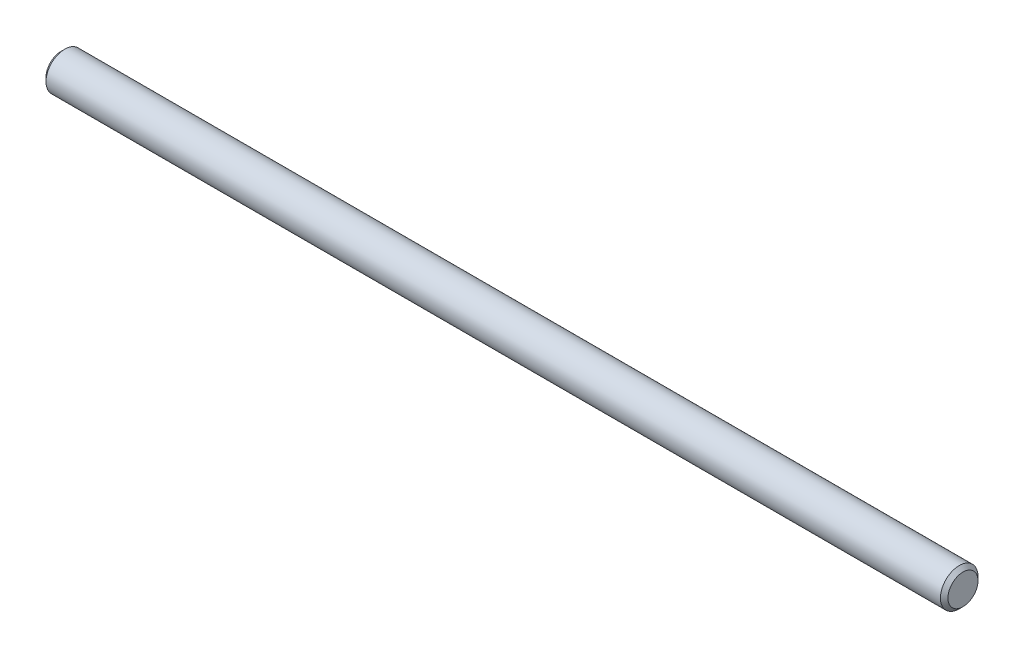
ISO-10303-21;
HEADER;
FILE_DESCRIPTION(('STEP AP214'),'2;1');
FILE_NAME('part.step','',(''),(''),'','','');
FILE_SCHEMA(('AUTOMOTIVE_DESIGN { 1 0 10303 214 1 1 1 1 }'));
ENDSEC;
DATA;
#1=APPLICATION_CONTEXT('core data for automotive mechanical design processes');
#2=APPLICATION_PROTOCOL_DEFINITION('international standard','automotive_design',2000,#1);
#3=PRODUCT_CONTEXT('',#1,'mechanical');
#4=PRODUCT('Part','Part','',(#3));
#5=PRODUCT_RELATED_PRODUCT_CATEGORY('part','',(#4));
#6=PRODUCT_DEFINITION_FORMATION('','',#4);
#7=PRODUCT_DEFINITION_CONTEXT('part definition',#1,'design');
#8=PRODUCT_DEFINITION('design','',#6,#7);
#9=PRODUCT_DEFINITION_SHAPE('','',#8);
#10=(LENGTH_UNIT() NAMED_UNIT(*) SI_UNIT(.MILLI.,.METRE.));
#11=(NAMED_UNIT(*) PLANE_ANGLE_UNIT() SI_UNIT($,.RADIAN.));
#12=(NAMED_UNIT(*) SI_UNIT($,.STERADIAN.) SOLID_ANGLE_UNIT());
#13=UNCERTAINTY_MEASURE_WITH_UNIT(LENGTH_MEASURE(1.E-05),#10,'distance_accuracy_value','');
#14=(GEOMETRIC_REPRESENTATION_CONTEXT(3) GLOBAL_UNCERTAINTY_ASSIGNED_CONTEXT((#13)) GLOBAL_UNIT_ASSIGNED_CONTEXT((#10,
#11,#12)) REPRESENTATION_CONTEXT('',''));
#15=CARTESIAN_POINT('',(0.,0.,0.));
#16=DIRECTION('',(0.,0.,1.));
#17=DIRECTION('',(1.,0.,0.));
#18=AXIS2_PLACEMENT_3D('',#15,#16,#17);
#19=CARTESIAN_POINT('',(96.,0.,0.));
#20=DIRECTION('',(-1.,0.,0.));
#21=DIRECTION('',(0.,0.,1.));
#22=AXIS2_PLACEMENT_3D('',#19,#20,#21);
#23=CYLINDRICAL_SURFACE('',#22,4.);
#24=CARTESIAN_POINT('',(-95.2,0.,0.));
#25=DIRECTION('',(1.,0.,0.));
#26=DIRECTION('',(0.,0.,-1.));
#27=AXIS2_PLACEMENT_3D('',#24,#25,#26);
#28=CIRCLE('',#27,4.);
#29=CARTESIAN_POINT('',(-95.2,0.,-4.));
#30=VERTEX_POINT('',#29);
#31=EDGE_CURVE('E48',#30,#30,#28,.T.);
#32=ORIENTED_EDGE('',*,*,#31,.T.);
#33=EDGE_LOOP('',(#32));
#34=FACE_BOUND('',#33,.T.);
#35=CARTESIAN_POINT('',(95.2,0.,0.));
#36=DIRECTION('',(1.,0.,0.));
#37=DIRECTION('',(0.,0.,-1.));
#38=AXIS2_PLACEMENT_3D('',#35,#36,#37);
#39=CIRCLE('',#38,4.);
#40=CARTESIAN_POINT('',(95.2,0.,-4.));
#41=VERTEX_POINT('',#40);
#42=EDGE_CURVE('E52',#41,#41,#39,.F.);
#43=ORIENTED_EDGE('',*,*,#42,.T.);
#44=EDGE_LOOP('',(#43));
#45=FACE_BOUND('',#44,.T.);
#46=ADVANCED_FACE('F37',(#34,#45),#23,.T.);
#47=CARTESIAN_POINT('',(96.,0.,0.));
#48=DIRECTION('',(1.,0.,0.));
#49=DIRECTION('',(0.,0.,-1.));
#50=AXIS2_PLACEMENT_3D('',#47,#48,#49);
#51=PLANE('',#50);
#52=CARTESIAN_POINT('',(96.,0.,0.));
#53=DIRECTION('',(1.,0.,0.));
#54=DIRECTION('',(0.,0.,-1.));
#55=AXIS2_PLACEMENT_3D('',#52,#53,#54);
#56=CIRCLE('',#55,3.19999999999998);
#57=CARTESIAN_POINT('',(96.,0.,-3.19999999999998));
#58=VERTEX_POINT('',#57);
#59=EDGE_CURVE('E10',#58,#58,#56,.T.);
#60=ORIENTED_EDGE('',*,*,#59,.T.);
#61=EDGE_LOOP('',(#60));
#62=FACE_BOUND('',#61,.T.);
#63=ADVANCED_FACE('F68',(#62),#51,.T.);
#64=CARTESIAN_POINT('',(-96.,0.,0.));
#65=DIRECTION('',(1.,0.,0.));
#66=DIRECTION('',(0.,0.,-1.));
#67=AXIS2_PLACEMENT_3D('',#64,#65,#66);
#68=PLANE('',#67);
#69=CARTESIAN_POINT('',(-96.,0.,0.));
#70=DIRECTION('',(1.,0.,0.));
#71=DIRECTION('',(0.,0.,-1.));
#72=AXIS2_PLACEMENT_3D('',#69,#70,#71);
#73=CIRCLE('',#72,3.19999999999995);
#74=CARTESIAN_POINT('',(-96.,0.,-3.19999999999995));
#75=VERTEX_POINT('',#74);
#76=EDGE_CURVE('E44',#75,#75,#73,.F.);
#77=ORIENTED_EDGE('',*,*,#76,.T.);
#78=EDGE_LOOP('',(#77));
#79=FACE_BOUND('',#78,.T.);
#80=ADVANCED_FACE('F65',(#79),#68,.F.);
#81=CARTESIAN_POINT('',(-95.2,0.,0.));
#82=DIRECTION('',(1.,0.,0.));
#83=DIRECTION('',(0.,0.,-1.));
#84=AXIS2_PLACEMENT_3D('',#81,#82,#83);
#85=CONICAL_SURFACE('',#84,4.,0.785398163397463);
#86=ORIENTED_EDGE('',*,*,#76,.F.);
#87=EDGE_LOOP('',(#86));
#88=FACE_BOUND('',#87,.T.);
#89=ORIENTED_EDGE('',*,*,#31,.F.);
#90=EDGE_LOOP('',(#89));
#91=FACE_BOUND('',#90,.T.);
#92=ADVANCED_FACE('F61',(#88,#91),#85,.T.);
#93=CARTESIAN_POINT('',(96.,0.,0.));
#94=DIRECTION('',(-1.,0.,0.));
#95=DIRECTION('',(0.,0.,1.));
#96=AXIS2_PLACEMENT_3D('',#93,#94,#95);
#97=CONICAL_SURFACE('',#96,3.19999999999998,0.785398163397455);
#98=ORIENTED_EDGE('',*,*,#42,.F.);
#99=EDGE_LOOP('',(#98));
#100=FACE_BOUND('',#99,.T.);
#101=ORIENTED_EDGE('',*,*,#59,.F.);
#102=EDGE_LOOP('',(#101));
#103=FACE_BOUND('',#102,.T.);
#104=ADVANCED_FACE('F39',(#100,#103),#97,.T.);
#105=CLOSED_SHELL('',(#46,#63,#80,#92,#104));
#106=MANIFOLD_SOLID_BREP('B2',#105);
#107=ADVANCED_BREP_SHAPE_REPRESENTATION('',(#18,#106),#14);
#108=SHAPE_DEFINITION_REPRESENTATION(#9,#107);
ENDSEC;
END-ISO-10303-21;
